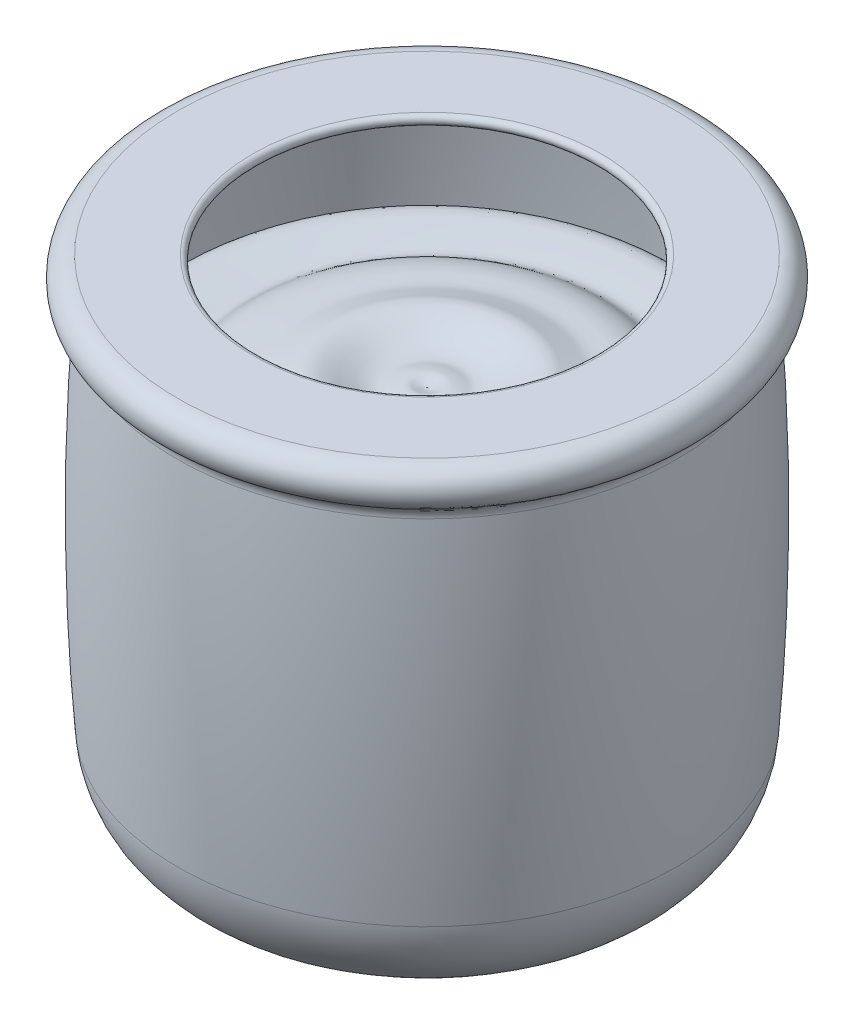
ISO-10303-21;
HEADER;
FILE_DESCRIPTION(('STEP AP214'),'2;1');
FILE_NAME('part.step','',(''),(''),'','','');
FILE_SCHEMA(('AUTOMOTIVE_DESIGN { 1 0 10303 214 1 1 1 1 }'));
ENDSEC;
DATA;
#1=APPLICATION_CONTEXT('core data for automotive mechanical design processes');
#2=APPLICATION_PROTOCOL_DEFINITION('international standard','automotive_design',2000,#1);
#3=PRODUCT_CONTEXT('',#1,'mechanical');
#4=PRODUCT('Part','Part','',(#3));
#5=PRODUCT_RELATED_PRODUCT_CATEGORY('part','',(#4));
#6=PRODUCT_DEFINITION_FORMATION('','',#4);
#7=PRODUCT_DEFINITION_CONTEXT('part definition',#1,'design');
#8=PRODUCT_DEFINITION('design','',#6,#7);
#9=PRODUCT_DEFINITION_SHAPE('','',#8);
#10=(LENGTH_UNIT() NAMED_UNIT(*) SI_UNIT(.MILLI.,.METRE.));
#11=(NAMED_UNIT(*) PLANE_ANGLE_UNIT() SI_UNIT($,.RADIAN.));
#12=(NAMED_UNIT(*) SI_UNIT($,.STERADIAN.) SOLID_ANGLE_UNIT());
#13=UNCERTAINTY_MEASURE_WITH_UNIT(LENGTH_MEASURE(1.E-05),#10,'distance_accuracy_value','');
#14=(GEOMETRIC_REPRESENTATION_CONTEXT(3) GLOBAL_UNCERTAINTY_ASSIGNED_CONTEXT((#13)) GLOBAL_UNIT_ASSIGNED_CONTEXT((#10,
#11,#12)) REPRESENTATION_CONTEXT('',''));
#15=CARTESIAN_POINT('',(0.,0.,0.));
#16=DIRECTION('',(0.,0.,1.));
#17=DIRECTION('',(1.,0.,0.));
#18=AXIS2_PLACEMENT_3D('',#15,#16,#17);
#19=CARTESIAN_POINT('',(0.,-80.,0.));
#20=DIRECTION('',(0.,1.,0.));
#21=DIRECTION('',(0.,0.,1.));
#22=AXIS2_PLACEMENT_3D('',#19,#20,#21);
#23=TOROIDAL_SURFACE('',#22,30.,18.);
#24=CARTESIAN_POINT('',(0.,-98.,0.));
#25=DIRECTION('',(0.,1.,0.));
#26=DIRECTION('',(0.,0.,1.));
#27=AXIS2_PLACEMENT_3D('',#24,#25,#26);
#28=CIRCLE('',#27,30.);
#29=CARTESIAN_POINT('',(0.,-98.,30.));
#30=VERTEX_POINT('',#29);
#31=EDGE_CURVE('E81',#30,#30,#28,.T.);
#32=ORIENTED_EDGE('',*,*,#31,.T.);
#33=EDGE_LOOP('',(#32));
#34=FACE_BOUND('',#33,.T.);
#35=CARTESIAN_POINT('',(0.,-81.3362044078281,0.));
#36=DIRECTION('',(0.,1.,0.));
#37=DIRECTION('',(0.,0.,1.));
#38=AXIS2_PLACEMENT_3D('',#35,#36,#37);
#39=CIRCLE('',#38,47.9503358681809);
#40=CARTESIAN_POINT('',(0.,-81.3362044078281,47.9503358681809));
#41=VERTEX_POINT('',#40);
#42=EDGE_CURVE('E12',#41,#41,#39,.T.);
#43=ORIENTED_EDGE('',*,*,#42,.F.);
#44=EDGE_LOOP('',(#43));
#45=FACE_BOUND('',#44,.T.);
#46=ADVANCED_FACE('F49',(#34,#45),#23,.T.);
#47=CARTESIAN_POINT('',(0.,-44.3678824579194,0.));
#48=DIRECTION('',(0.,1.,0.));
#49=DIRECTION('',(0.,0.,1.));
#50=AXIS2_PLACEMENT_3D('',#47,#48,#49);
#51=DEGENERATE_TOROIDAL_SURFACE('',#50,448.67562315149,498.,.F.);
#52=ORIENTED_EDGE('',*,*,#42,.T.);
#53=EDGE_LOOP('',(#52));
#54=FACE_BOUND('',#53,.T.);
#55=CARTESIAN_POINT('',(0.,-51.4729107473527,0.));
#56=DIRECTION('',(0.,1.,0.));
#57=DIRECTION('',(0.,0.,1.));
#58=AXIS2_PLACEMENT_3D('',#55,#56,#57);
#59=CIRCLE('',#58,49.2736901053979);
#60=CARTESIAN_POINT('',(0.,-51.4729107473527,49.2736901053979));
#61=VERTEX_POINT('',#60);
#62=EDGE_CURVE('E56',#61,#61,#59,.T.);
#63=ORIENTED_EDGE('',*,*,#62,.F.);
#64=EDGE_LOOP('',(#63));
#65=FACE_BOUND('',#64,.T.);
#66=ADVANCED_FACE('F62',(#54,#65),#51,.F.);
#67=CARTESIAN_POINT('',(0.,-23.0146083525223,0.));
#68=CARTESIAN_POINT('',(-0.136205946218936,-23.6343670258665,0.));
#69=CARTESIAN_POINT('',(-2.80619591311098,-21.5825684979064,0.));
#70=CARTESIAN_POINT('',(-6.04068483993989,-23.480386073086,0.));
#71=CARTESIAN_POINT('',(-11.3127410876875,-22.5249743213954,0.));
#72=CARTESIAN_POINT('',(-16.6824492709856,-18.6764981724019,0.));
#73=CARTESIAN_POINT('',(-22.8218569879061,-22.6133667523659,0.));
#74=CARTESIAN_POINT('',(-28.4260910931648,-22.1743415670278,0.));
#75=CARTESIAN_POINT('',(-34.0997028657178,-23.7151629236209,0.));
#76=CARTESIAN_POINT('',(-36.8160710253229,-27.4412230933724,0.));
#77=CARTESIAN_POINT('',(-50.3130832129332,-21.6638991869829,0.));
#78=CARTESIAN_POINT('',(-51.6997298116328,-35.2177272548711,0.));
#79=CARTESIAN_POINT('',(-28.8133795301676,-26.3541201000728,0.));
#80=CARTESIAN_POINT('',(-52.0021934694794,-39.3950211934494,0.));
#81=CARTESIAN_POINT('',(-49.2736901053979,-51.4729107473527,0.));
#82=B_SPLINE_CURVE_WITH_KNOTS('',3,(#67,#68,#69,#70,#71,#72,#73,#74,#75,#76,#77,#78,#79,#80,
#81),.UNSPECIFIED.,.F.,.F.,(4,1,1,1,1,1,1,1,1,1,1,1,4),(0.,0.0490013176334555,0.111158945990815,
0.149259216770712,0.282337741442116,0.362292466018908,0.440589003804251,0.532498598776863,
0.596121049134983,0.672064713589604,0.753321627784852,0.786115156425892,1.),.UNSPECIFIED.);
#83=CARTESIAN_POINT('',(0.,-23.0146083525223,0.));
#84=DIRECTION('',(0.,1.,0.));
#85=AXIS1_PLACEMENT('',#83,#84);
#86=SURFACE_OF_REVOLUTION('',#82,#85);
#87=ORIENTED_EDGE('',*,*,#62,.T.);
#88=EDGE_LOOP('',(#87));
#89=FACE_BOUND('',#88,.T.);
#90=CARTESIAN_POINT('',(0.,-23.0146083525223,0.));
#91=VERTEX_POINT('',#90);
#92=VERTEX_LOOP('',#91);
#93=FACE_BOUND('',#92,.T.);
#94=ADVANCED_FACE('F59',(#89,#93),#86,.F.);
#95=CARTESIAN_POINT('',(0.,-98.,0.));
#96=DIRECTION('',(0.,-1.,0.));
#97=DIRECTION('',(0.,0.,-1.));
#98=AXIS2_PLACEMENT_3D('',#95,#96,#97);
#99=PLANE('',#98);
#100=ORIENTED_EDGE('',*,*,#31,.F.);
#101=EDGE_LOOP('',(#100));
#102=FACE_BOUND('',#101,.T.);
#103=ADVANCED_FACE('F61',(#102),#99,.T.);
#104=CLOSED_SHELL('',(#46,#66,#94,#103));
#105=MANIFOLD_SOLID_BREP('B2',#104);
#106=CARTESIAN_POINT('',(0.,-98.,0.));
#107=DIRECTION('',(0.,1.,0.));
#108=DIRECTION('',(-1.,0.,0.));
#109=AXIS2_PLACEMENT_3D('',#106,#107,#108);
#110=PLANE('',#109);
#111=CARTESIAN_POINT('',(0.,-98.,0.));
#112=DIRECTION('',(0.,1.,0.));
#113=DIRECTION('',(-1.,0.,0.));
#114=AXIS2_PLACEMENT_3D('',#111,#112,#113);
#115=CIRCLE('',#114,30.);
#116=CARTESIAN_POINT('',(-30.,-98.,0.));
#117=VERTEX_POINT('',#116);
#118=EDGE_CURVE('E48',#117,#117,#115,.T.);
#119=ORIENTED_EDGE('',*,*,#118,.T.);
#120=EDGE_LOOP('',(#119));
#121=FACE_BOUND('',#120,.T.);
#122=ADVANCED_FACE('F132',(#121),#110,.T.);
#123=CARTESIAN_POINT('',(0.,-80.,0.));
#124=DIRECTION('',(0.,1.,0.));
#125=DIRECTION('',(-1.,0.,0.));
#126=AXIS2_PLACEMENT_3D('',#123,#124,#125);
#127=TOROIDAL_SURFACE('',#126,30.,18.);
#128=CARTESIAN_POINT('',(0.,-81.3362044078279,0.));
#129=DIRECTION('',(0.,1.,0.));
#130=DIRECTION('',(-1.,0.,0.));
#131=AXIS2_PLACEMENT_3D('',#128,#129,#130);
#132=CIRCLE('',#131,47.9503358681809);
#133=CARTESIAN_POINT('',(-47.9503358681809,-81.3362044078279,0.));
#134=VERTEX_POINT('',#133);
#135=EDGE_CURVE('E138',#134,#134,#132,.T.);
#136=ORIENTED_EDGE('',*,*,#135,.T.);
#137=EDGE_LOOP('',(#136));
#138=FACE_BOUND('',#137,.T.);
#139=ORIENTED_EDGE('',*,*,#118,.F.);
#140=EDGE_LOOP('',(#139));
#141=FACE_BOUND('',#140,.T.);
#142=ADVANCED_FACE('F188',(#138,#141),#127,.F.);
#143=CARTESIAN_POINT('',(0.,-44.3678824579194,0.));
#144=DIRECTION('',(0.,1.,0.));
#145=DIRECTION('',(-1.,0.,0.));
#146=AXIS2_PLACEMENT_3D('',#143,#144,#145);
#147=DEGENERATE_TOROIDAL_SURFACE('',#146,448.67562315149,498.,.F.);
#148=CARTESIAN_POINT('',(0.,-10.5825730243583,0.));
#149=DIRECTION('',(0.,1.,0.));
#150=DIRECTION('',(-1.,0.,0.));
#151=AXIS2_PLACEMENT_3D('',#148,#149,#150);
#152=CIRCLE('',#151,48.1770238843072);
#153=CARTESIAN_POINT('',(-48.1770238843072,-10.5825730243583,0.));
#154=VERTEX_POINT('',#153);
#155=EDGE_CURVE('E142',#154,#154,#152,.T.);
#156=ORIENTED_EDGE('',*,*,#155,.T.);
#157=EDGE_LOOP('',(#156));
#158=FACE_BOUND('',#157,.T.);
#159=ORIENTED_EDGE('',*,*,#135,.F.);
#160=EDGE_LOOP('',(#159));
#161=FACE_BOUND('',#160,.T.);
#162=ADVANCED_FACE('F192',(#158,#161),#147,.T.);
#163=CARTESIAN_POINT('',(0.,-10.2433630902865,0.));
#164=DIRECTION('',(0.,1.,0.));
#165=DIRECTION('',(-1.,0.,0.));
#166=AXIS2_PLACEMENT_3D('',#163,#164,#165);
#167=TOROIDAL_SURFACE('',#166,53.1655042762328,4.99999999999999);
#168=CARTESIAN_POINT('',(0.,-5.78381802579614,0.));
#169=DIRECTION('',(0.,1.,0.));
#170=DIRECTION('',(-1.,0.,0.));
#171=AXIS2_PLACEMENT_3D('',#168,#169,#170);
#172=CIRCLE('',#171,50.9044297932094);
#173=CARTESIAN_POINT('',(-50.9044297932094,-5.78381802579614,0.));
#174=VERTEX_POINT('',#173);
#175=EDGE_CURVE('E146',#174,#174,#172,.T.);
#176=ORIENTED_EDGE('',*,*,#175,.T.);
#177=EDGE_LOOP('',(#176));
#178=FACE_BOUND('',#177,.T.);
#179=ORIENTED_EDGE('',*,*,#155,.F.);
#180=EDGE_LOOP('',(#179));
#181=FACE_BOUND('',#180,.T.);
#182=ADVANCED_FACE('F196',(#178,#181),#167,.T.);
#183=CARTESIAN_POINT('',(0.,-4.,0.));
#184=DIRECTION('',(0.,1.,0.));
#185=DIRECTION('',(-1.,0.,0.));
#186=AXIS2_PLACEMENT_3D('',#183,#184,#185);
#187=TOROIDAL_SURFACE('',#186,50.,2.);
#188=CARTESIAN_POINT('',(0.,-2.,0.));
#189=DIRECTION('',(0.,1.,0.));
#190=DIRECTION('',(-1.,0.,0.));
#191=AXIS2_PLACEMENT_3D('',#188,#189,#190);
#192=CIRCLE('',#191,50.);
#193=CARTESIAN_POINT('',(-50.,-2.,0.));
#194=VERTEX_POINT('',#193);
#195=EDGE_CURVE('E151',#194,#194,#192,.T.);
#196=ORIENTED_EDGE('',*,*,#195,.T.);
#197=EDGE_LOOP('',(#196));
#198=FACE_BOUND('',#197,.T.);
#199=ORIENTED_EDGE('',*,*,#175,.F.);
#200=EDGE_LOOP('',(#199));
#201=FACE_BOUND('',#200,.T.);
#202=ADVANCED_FACE('F203',(#198,#201),#187,.F.);
#203=CARTESIAN_POINT('',(-50.,-2.,0.));
#204=DIRECTION('',(0.,-1.,0.));
#205=DIRECTION('',(1.,0.,0.));
#206=AXIS2_PLACEMENT_3D('',#203,#204,#205);
#207=PLANE('',#206);
#208=CARTESIAN_POINT('',(0.,-2.,0.));
#209=DIRECTION('',(0.,1.,0.));
#210=DIRECTION('',(-1.,0.,0.));
#211=AXIS2_PLACEMENT_3D('',#208,#209,#210);
#212=CIRCLE('',#211,35.);
#213=CARTESIAN_POINT('',(-35.,-2.,0.));
#214=VERTEX_POINT('',#213);
#215=EDGE_CURVE('E154',#214,#214,#212,.T.);
#216=ORIENTED_EDGE('',*,*,#215,.T.);
#217=EDGE_LOOP('',(#216));
#218=FACE_BOUND('',#217,.T.);
#219=ORIENTED_EDGE('',*,*,#195,.F.);
#220=EDGE_LOOP('',(#219));
#221=FACE_BOUND('',#220,.T.);
#222=ADVANCED_FACE('F207',(#218,#221),#207,.T.);
#223=CARTESIAN_POINT('',(0.,-1.,0.));
#224=DIRECTION('',(0.,1.,0.));
#225=DIRECTION('',(-1.,0.,0.));
#226=AXIS2_PLACEMENT_3D('',#223,#224,#225);
#227=TOROIDAL_SURFACE('',#226,35.,1.);
#228=CARTESIAN_POINT('',(0.,0.,0.));
#229=DIRECTION('',(0.,1.,0.));
#230=DIRECTION('',(-1.,0.,0.));
#231=AXIS2_PLACEMENT_3D('',#228,#229,#230);
#232=CIRCLE('',#231,35.);
#233=CARTESIAN_POINT('',(-35.,0.,0.));
#234=VERTEX_POINT('',#233);
#235=EDGE_CURVE('E157',#234,#234,#232,.T.);
#236=ORIENTED_EDGE('',*,*,#235,.T.);
#237=EDGE_LOOP('',(#236));
#238=FACE_BOUND('',#237,.T.);
#239=ORIENTED_EDGE('',*,*,#215,.F.);
#240=EDGE_LOOP('',(#239));
#241=FACE_BOUND('',#240,.T.);
#242=ADVANCED_FACE('F211',(#238,#241),#227,.T.);
#243=CARTESIAN_POINT('',(-50.,0.,0.));
#244=DIRECTION('',(0.,1.,0.));
#245=DIRECTION('',(-1.,0.,0.));
#246=AXIS2_PLACEMENT_3D('',#243,#244,#245);
#247=PLANE('',#246);
#248=CARTESIAN_POINT('',(0.,0.,0.));
#249=DIRECTION('',(0.,1.,0.));
#250=DIRECTION('',(-1.,0.,0.));
#251=AXIS2_PLACEMENT_3D('',#248,#249,#250);
#252=CIRCLE('',#251,50.);
#253=CARTESIAN_POINT('',(-50.,0.,0.));
#254=VERTEX_POINT('',#253);
#255=EDGE_CURVE('E160',#254,#254,#252,.T.);
#256=ORIENTED_EDGE('',*,*,#255,.T.);
#257=EDGE_LOOP('',(#256));
#258=FACE_BOUND('',#257,.T.);
#259=ORIENTED_EDGE('',*,*,#235,.F.);
#260=EDGE_LOOP('',(#259));
#261=FACE_BOUND('',#260,.T.);
#262=ADVANCED_FACE('F215',(#258,#261),#247,.T.);
#263=CARTESIAN_POINT('',(0.,-4.,0.));
#264=DIRECTION('',(0.,1.,0.));
#265=DIRECTION('',(-1.,0.,0.));
#266=AXIS2_PLACEMENT_3D('',#263,#264,#265);
#267=TOROIDAL_SURFACE('',#266,50.,4.);
#268=CARTESIAN_POINT('',(0.,-7.56763605159234,0.));
#269=DIRECTION('',(0.,1.,0.));
#270=DIRECTION('',(-1.,0.,0.));
#271=AXIS2_PLACEMENT_3D('',#268,#269,#270);
#272=CIRCLE('',#271,51.8088595864188);
#273=CARTESIAN_POINT('',(-51.8088595864188,-7.56763605159233,0.));
#274=VERTEX_POINT('',#273);
#275=EDGE_CURVE('E163',#274,#274,#272,.T.);
#276=ORIENTED_EDGE('',*,*,#275,.T.);
#277=EDGE_LOOP('',(#276));
#278=FACE_BOUND('',#277,.T.);
#279=ORIENTED_EDGE('',*,*,#255,.F.);
#280=EDGE_LOOP('',(#279));
#281=FACE_BOUND('',#280,.T.);
#282=ADVANCED_FACE('F219',(#278,#281),#267,.T.);
#283=CARTESIAN_POINT('',(0.,-10.2433630902865,0.));
#284=DIRECTION('',(0.,1.,0.));
#285=DIRECTION('',(-1.,0.,0.));
#286=AXIS2_PLACEMENT_3D('',#283,#284,#285);
#287=TOROIDAL_SURFACE('',#286,53.1655042762328,2.99999999999993);
#288=CARTESIAN_POINT('',(0.,-10.4468890507295,0.));
#289=DIRECTION('',(0.,1.,0.));
#290=DIRECTION('',(-1.,0.,0.));
#291=AXIS2_PLACEMENT_3D('',#288,#289,#290);
#292=CIRCLE('',#291,50.1724160410774);
#293=CARTESIAN_POINT('',(-50.1724160410774,-10.4468890507295,0.));
#294=VERTEX_POINT('',#293);
#295=EDGE_CURVE('E166',#294,#294,#292,.T.);
#296=ORIENTED_EDGE('',*,*,#295,.T.);
#297=EDGE_LOOP('',(#296));
#298=FACE_BOUND('',#297,.T.);
#299=ORIENTED_EDGE('',*,*,#275,.F.);
#300=EDGE_LOOP('',(#299));
#301=FACE_BOUND('',#300,.T.);
#302=ADVANCED_FACE('F223',(#298,#301),#287,.F.);
#303=CARTESIAN_POINT('',(0.,-44.3678824579194,0.));
#304=DIRECTION('',(0.,1.,0.));
#305=DIRECTION('',(-1.,0.,0.));
#306=AXIS2_PLACEMENT_3D('',#303,#304,#305);
#307=DEGENERATE_TOROIDAL_SURFACE('',#306,448.67562315149,500.,.F.);
#308=CARTESIAN_POINT('',(0.,-81.4846715642534,0.));
#309=DIRECTION('',(0.,1.,0.));
#310=DIRECTION('',(-1.,0.,0.));
#311=AXIS2_PLACEMENT_3D('',#308,#309,#310);
#312=CIRCLE('',#311,49.944817631312);
#313=CARTESIAN_POINT('',(-49.944817631312,-81.4846715642534,0.));
#314=VERTEX_POINT('',#313);
#315=EDGE_CURVE('E169',#314,#314,#312,.T.);
#316=ORIENTED_EDGE('',*,*,#315,.T.);
#317=EDGE_LOOP('',(#316));
#318=FACE_BOUND('',#317,.T.);
#319=ORIENTED_EDGE('',*,*,#295,.F.);
#320=EDGE_LOOP('',(#319));
#321=FACE_BOUND('',#320,.T.);
#322=ADVANCED_FACE('F185',(#318,#321),#307,.F.);
#323=CARTESIAN_POINT('',(0.,-80.,0.));
#324=DIRECTION('',(0.,1.,0.));
#325=DIRECTION('',(-1.,0.,0.));
#326=AXIS2_PLACEMENT_3D('',#323,#324,#325);
#327=TOROIDAL_SURFACE('',#326,30.,20.);
#328=CARTESIAN_POINT('',(0.,-100.,0.));
#329=DIRECTION('',(0.,1.,0.));
#330=DIRECTION('',(-1.,0.,0.));
#331=AXIS2_PLACEMENT_3D('',#328,#329,#330);
#332=CIRCLE('',#331,30.);
#333=CARTESIAN_POINT('',(-30.,-100.,0.));
#334=VERTEX_POINT('',#333);
#335=EDGE_CURVE('E172',#334,#334,#332,.T.);
#336=ORIENTED_EDGE('',*,*,#335,.T.);
#337=EDGE_LOOP('',(#336));
#338=FACE_BOUND('',#337,.T.);
#339=ORIENTED_EDGE('',*,*,#315,.F.);
#340=EDGE_LOOP('',(#339));
#341=FACE_BOUND('',#340,.T.);
#342=ADVANCED_FACE('F176',(#338,#341),#327,.T.);
#343=CARTESIAN_POINT('',(0.,-100.,0.));
#344=DIRECTION('',(0.,-1.,0.));
#345=DIRECTION('',(1.,0.,0.));
#346=AXIS2_PLACEMENT_3D('',#343,#344,#345);
#347=PLANE('',#346);
#348=ORIENTED_EDGE('',*,*,#335,.F.);
#349=EDGE_LOOP('',(#348));
#350=FACE_BOUND('',#349,.T.);
#351=ADVANCED_FACE('F179',(#350),#347,.T.);
#352=CLOSED_SHELL('',(#122,#142,#162,#182,#202,#222,#242,#262,#282,#302,#322,#342,#351));
#353=MANIFOLD_SOLID_BREP('B6',#352);
#354=ADVANCED_BREP_SHAPE_REPRESENTATION('',(#18,#105,#353),#14);
#355=SHAPE_DEFINITION_REPRESENTATION(#9,#354);
ENDSEC;
END-ISO-10303-21;
